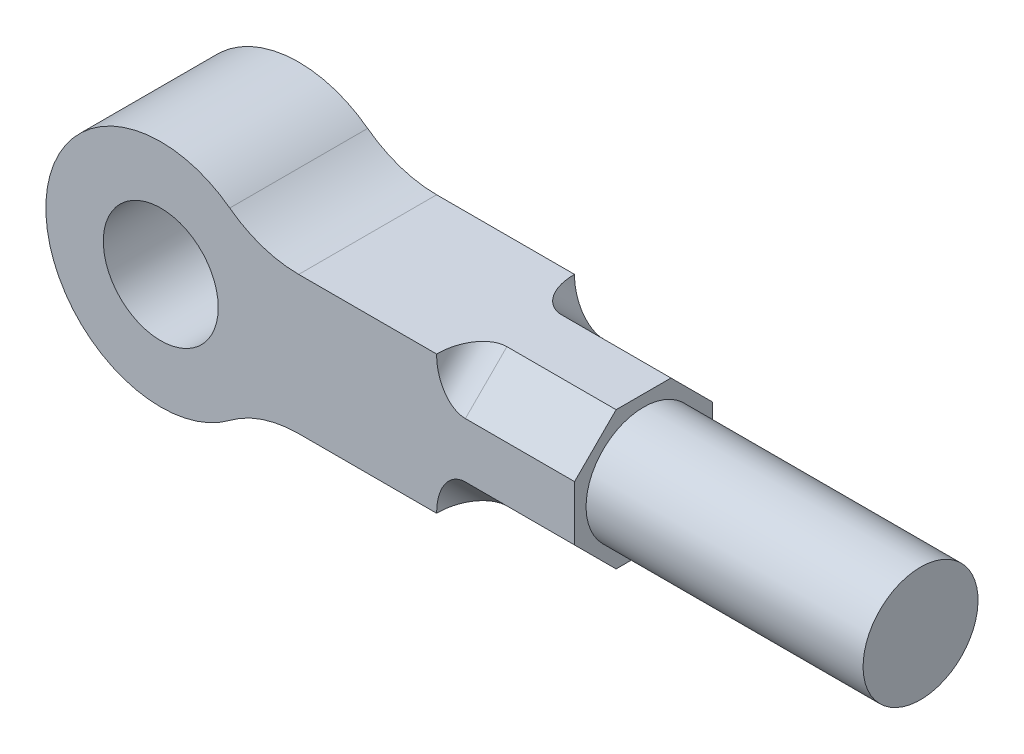
ISO-10303-21;
HEADER;
FILE_DESCRIPTION(('STEP AP214'),'2;1');
FILE_NAME('part.step','',(''),(''),'','','');
FILE_SCHEMA(('AUTOMOTIVE_DESIGN { 1 0 10303 214 1 1 1 1 }'));
ENDSEC;
DATA;
#1=APPLICATION_CONTEXT('core data for automotive mechanical design processes');
#2=APPLICATION_PROTOCOL_DEFINITION('international standard','automotive_design',2000,#1);
#3=PRODUCT_CONTEXT('',#1,'mechanical');
#4=PRODUCT('Part','Part','',(#3));
#5=PRODUCT_RELATED_PRODUCT_CATEGORY('part','',(#4));
#6=PRODUCT_DEFINITION_FORMATION('','',#4);
#7=PRODUCT_DEFINITION_CONTEXT('part definition',#1,'design');
#8=PRODUCT_DEFINITION('design','',#6,#7);
#9=PRODUCT_DEFINITION_SHAPE('','',#8);
#10=(LENGTH_UNIT() NAMED_UNIT(*) SI_UNIT(.MILLI.,.METRE.));
#11=(NAMED_UNIT(*) PLANE_ANGLE_UNIT() SI_UNIT($,.RADIAN.));
#12=(NAMED_UNIT(*) SI_UNIT($,.STERADIAN.) SOLID_ANGLE_UNIT());
#13=UNCERTAINTY_MEASURE_WITH_UNIT(LENGTH_MEASURE(1.E-05),#10,'distance_accuracy_value','');
#14=(GEOMETRIC_REPRESENTATION_CONTEXT(3) GLOBAL_UNCERTAINTY_ASSIGNED_CONTEXT((#13)) GLOBAL_UNIT_ASSIGNED_CONTEXT((#10,
#11,#12)) REPRESENTATION_CONTEXT('',''));
#15=CARTESIAN_POINT('',(0.,0.,0.));
#16=DIRECTION('',(0.,0.,1.));
#17=DIRECTION('',(1.,0.,0.));
#18=AXIS2_PLACEMENT_3D('',#15,#16,#17);
#19=CARTESIAN_POINT('',(60.,-80.,30.));
#20=DIRECTION('',(0.,0.,-1.));
#21=DIRECTION('',(-1.,0.,0.));
#22=AXIS2_PLACEMENT_3D('',#19,#20,#21);
#23=PLANE('',#22);
#24=DIRECTION('',(0.,-1.,0.));
#25=VECTOR('',#24,1.);
#26=CARTESIAN_POINT('',(120.,0.,30.));
#27=LINE('',#26,#25);
#28=CARTESIAN_POINT('',(120.,-29.617669529667,30.));
#29=VERTEX_POINT('',#28);
#30=CARTESIAN_POINT('',(120.,-29.9999999999999,30.));
#31=VERTEX_POINT('',#30);
#32=EDGE_CURVE('E354',#29,#31,#27,.T.);
#33=ORIENTED_EDGE('',*,*,#32,.F.);
#34=CARTESIAN_POINT('',(132.5,-29.6176695296671,30.));
#35=DIRECTION('',(0.,0.,-1.));
#36=DIRECTION('',(0.,1.,0.));
#37=AXIS2_PLACEMENT_3D('',#34,#35,#36);
#38=ELLIPSE('',#37,17.6776695296637,12.5);
#39=CARTESIAN_POINT('',(132.5,-11.9400000000054,30.));
#40=VERTEX_POINT('',#39);
#41=EDGE_CURVE('E277',#29,#40,#38,.T.);
#42=ORIENTED_EDGE('',*,*,#41,.T.);
#43=DIRECTION('',(1.,0.,0.));
#44=VECTOR('',#43,1.);
#45=CARTESIAN_POINT('',(120.,-11.9400000000053,30.));
#46=LINE('',#45,#44);
#47=CARTESIAN_POINT('',(180.,-11.9400000000054,30.));
#48=VERTEX_POINT('',#47);
#49=EDGE_CURVE('E326',#40,#48,#46,.T.);
#50=ORIENTED_EDGE('',*,*,#49,.T.);
#51=DIRECTION('',(0.,1.,0.));
#52=VECTOR('',#51,1.);
#53=CARTESIAN_POINT('',(180.,30.,30.));
#54=LINE('',#53,#52);
#55=CARTESIAN_POINT('',(180.,11.9399999999981,30.));
#56=VERTEX_POINT('',#55);
#57=EDGE_CURVE('E293',#48,#56,#54,.T.);
#58=ORIENTED_EDGE('',*,*,#57,.T.);
#59=DIRECTION('',(1.,0.,0.));
#60=VECTOR('',#59,1.);
#61=CARTESIAN_POINT('',(120.,11.9399999999981,30.));
#62=LINE('',#61,#60);
#63=CARTESIAN_POINT('',(132.5,11.9399999999981,30.));
#64=VERTEX_POINT('',#63);
#65=EDGE_CURVE('E315',#64,#56,#62,.T.);
#66=ORIENTED_EDGE('',*,*,#65,.F.);
#67=CARTESIAN_POINT('',(132.5,29.6176695296618,30.));
#68=DIRECTION('',(0.,0.,-1.));
#69=DIRECTION('',(0.,1.,0.));
#70=AXIS2_PLACEMENT_3D('',#67,#68,#69);
#71=ELLIPSE('',#70,17.6776695296637,12.5);
#72=CARTESIAN_POINT('',(120.,29.6176695296618,30.));
#73=VERTEX_POINT('',#72);
#74=EDGE_CURVE('E11',#64,#73,#71,.T.);
#75=ORIENTED_EDGE('',*,*,#74,.T.);
#76=DIRECTION('',(0.,-1.,0.));
#77=VECTOR('',#76,1.);
#78=CARTESIAN_POINT('',(120.,0.,30.));
#79=LINE('',#78,#77);
#80=CARTESIAN_POINT('',(120.,30.0000000000001,30.));
#81=VERTEX_POINT('',#80);
#82=EDGE_CURVE('E325',#81,#73,#79,.T.);
#83=ORIENTED_EDGE('',*,*,#82,.F.);
#84=DIRECTION('',(-1.,0.,0.));
#85=VECTOR('',#84,1.);
#86=CARTESIAN_POINT('',(60.,30.,30.));
#87=LINE('',#86,#85);
#88=CARTESIAN_POINT('',(60.,30.,30.));
#89=VERTEX_POINT('',#88);
#90=EDGE_CURVE('E290',#81,#89,#87,.T.);
#91=ORIENTED_EDGE('',*,*,#90,.T.);
#92=CARTESIAN_POINT('',(60.,80.,30.));
#93=DIRECTION('',(0.,0.,-1.));
#94=DIRECTION('',(-1.,0.,0.));
#95=AXIS2_PLACEMENT_3D('',#92,#93,#94);
#96=CIRCLE('',#95,50.);
#97=CARTESIAN_POINT('',(30.,40.,30.));
#98=VERTEX_POINT('',#97);
#99=EDGE_CURVE('E288',#89,#98,#96,.T.);
#100=ORIENTED_EDGE('',*,*,#99,.T.);
#101=CARTESIAN_POINT('',(0.,0.,30.));
#102=DIRECTION('',(0.,0.,1.));
#103=DIRECTION('',(1.,0.,0.));
#104=AXIS2_PLACEMENT_3D('',#101,#102,#103);
#105=CIRCLE('',#104,50.);
#106=CARTESIAN_POINT('',(30.,-40.,30.));
#107=VERTEX_POINT('',#106);
#108=EDGE_CURVE('E222',#98,#107,#105,.T.);
#109=ORIENTED_EDGE('',*,*,#108,.T.);
#110=CARTESIAN_POINT('',(60.,-80.,30.));
#111=DIRECTION('',(0.,0.,-1.));
#112=DIRECTION('',(-1.,0.,0.));
#113=AXIS2_PLACEMENT_3D('',#110,#111,#112);
#114=CIRCLE('',#113,50.);
#115=CARTESIAN_POINT('',(60.,-30.,30.));
#116=VERTEX_POINT('',#115);
#117=EDGE_CURVE('E216',#107,#116,#114,.T.);
#118=ORIENTED_EDGE('',*,*,#117,.T.);
#119=DIRECTION('',(1.,0.,0.));
#120=VECTOR('',#119,1.);
#121=CARTESIAN_POINT('',(60.,-30.,30.));
#122=LINE('',#121,#120);
#123=EDGE_CURVE('E297',#116,#31,#122,.T.);
#124=ORIENTED_EDGE('',*,*,#123,.T.);
#125=EDGE_LOOP('',(#33,#42,#50,#58,#66,#75,#83,#91,#100,#109,#118,#124));
#126=FACE_BOUND('',#125,.T.);
#127=CARTESIAN_POINT('',(0.,0.,30.));
#128=DIRECTION('',(0.,0.,1.));
#129=DIRECTION('',(1.,0.,0.));
#130=AXIS2_PLACEMENT_3D('',#127,#128,#129);
#131=CIRCLE('',#130,25.);
#132=CARTESIAN_POINT('',(25.,0.,30.));
#133=VERTEX_POINT('',#132);
#134=EDGE_CURVE('E204',#133,#133,#131,.T.);
#135=ORIENTED_EDGE('',*,*,#134,.F.);
#136=EDGE_LOOP('',(#135));
#137=FACE_BOUND('',#136,.T.);
#138=ADVANCED_FACE('F41',(#126,#137),#23,.F.);
#139=CARTESIAN_POINT('',(60.,-80.,-30.));
#140=DIRECTION('',(0.,0.,-1.));
#141=DIRECTION('',(-1.,0.,0.));
#142=AXIS2_PLACEMENT_3D('',#139,#140,#141);
#143=PLANE('',#142);
#144=DIRECTION('',(0.,1.,0.));
#145=VECTOR('',#144,1.);
#146=CARTESIAN_POINT('',(120.,0.,-30.));
#147=LINE('',#146,#145);
#148=CARTESIAN_POINT('',(120.,29.6176695296638,-30.));
#149=VERTEX_POINT('',#148);
#150=CARTESIAN_POINT('',(120.,30.,-30.));
#151=VERTEX_POINT('',#150);
#152=EDGE_CURVE('E336',#149,#151,#147,.T.);
#153=ORIENTED_EDGE('',*,*,#152,.F.);
#154=CARTESIAN_POINT('',(132.5,29.6176695296638,-30.));
#155=DIRECTION('',(0.,0.,-1.));
#156=DIRECTION('',(0.,-1.,0.));
#157=AXIS2_PLACEMENT_3D('',#154,#155,#156);
#158=ELLIPSE('',#157,17.6776695296637,12.5);
#159=CARTESIAN_POINT('',(132.5,11.9400000000001,-30.));
#160=VERTEX_POINT('',#159);
#161=EDGE_CURVE('E271',#149,#160,#158,.F.);
#162=ORIENTED_EDGE('',*,*,#161,.T.);
#163=DIRECTION('',(1.,0.,0.));
#164=VECTOR('',#163,1.);
#165=CARTESIAN_POINT('',(120.,11.9400000000001,-30.));
#166=LINE('',#165,#164);
#167=CARTESIAN_POINT('',(180.,11.94,-30.));
#168=VERTEX_POINT('',#167);
#169=EDGE_CURVE('E335',#160,#168,#166,.T.);
#170=ORIENTED_EDGE('',*,*,#169,.T.);
#171=DIRECTION('',(0.,1.,0.));
#172=VECTOR('',#171,1.);
#173=CARTESIAN_POINT('',(180.,30.,-30.));
#174=LINE('',#173,#172);
#175=CARTESIAN_POINT('',(180.,-11.9400000000054,-30.));
#176=VERTEX_POINT('',#175);
#177=EDGE_CURVE('E196',#176,#168,#174,.T.);
#178=ORIENTED_EDGE('',*,*,#177,.F.);
#179=DIRECTION('',(1.,0.,0.));
#180=VECTOR('',#179,1.);
#181=CARTESIAN_POINT('',(120.,-11.9400000000053,-30.));
#182=LINE('',#181,#180);
#183=CARTESIAN_POINT('',(132.5,-11.9400000000054,-30.));
#184=VERTEX_POINT('',#183);
#185=EDGE_CURVE('E175',#184,#176,#182,.T.);
#186=ORIENTED_EDGE('',*,*,#185,.F.);
#187=CARTESIAN_POINT('',(132.5,-29.617669529669,-30.));
#188=DIRECTION('',(0.,0.,-1.));
#189=DIRECTION('',(0.,-1.,0.));
#190=AXIS2_PLACEMENT_3D('',#187,#188,#189);
#191=ELLIPSE('',#190,17.6776695296637,12.5);
#192=CARTESIAN_POINT('',(120.,-29.617669529669,-30.));
#193=VERTEX_POINT('',#192);
#194=EDGE_CURVE('E186',#184,#193,#191,.F.);
#195=ORIENTED_EDGE('',*,*,#194,.T.);
#196=DIRECTION('',(0.,1.,0.));
#197=VECTOR('',#196,1.);
#198=CARTESIAN_POINT('',(120.,0.,-30.));
#199=LINE('',#198,#197);
#200=CARTESIAN_POINT('',(120.,-29.9999999999999,-30.));
#201=VERTEX_POINT('',#200);
#202=EDGE_CURVE('E169',#201,#193,#199,.T.);
#203=ORIENTED_EDGE('',*,*,#202,.F.);
#204=DIRECTION('',(1.,0.,0.));
#205=VECTOR('',#204,1.);
#206=CARTESIAN_POINT('',(60.,-30.,-30.));
#207=LINE('',#206,#205);
#208=CARTESIAN_POINT('',(60.,-30.,-30.));
#209=VERTEX_POINT('',#208);
#210=EDGE_CURVE('E182',#209,#201,#207,.T.);
#211=ORIENTED_EDGE('',*,*,#210,.F.);
#212=CARTESIAN_POINT('',(60.,-80.,-30.));
#213=DIRECTION('',(0.,0.,-1.));
#214=DIRECTION('',(-1.,0.,0.));
#215=AXIS2_PLACEMENT_3D('',#212,#213,#214);
#216=CIRCLE('',#215,50.);
#217=CARTESIAN_POINT('',(30.,-40.,-30.));
#218=VERTEX_POINT('',#217);
#219=EDGE_CURVE('E197',#218,#209,#216,.T.);
#220=ORIENTED_EDGE('',*,*,#219,.F.);
#221=CARTESIAN_POINT('',(0.,0.,-30.));
#222=DIRECTION('',(0.,0.,1.));
#223=DIRECTION('',(1.,0.,0.));
#224=AXIS2_PLACEMENT_3D('',#221,#222,#223);
#225=CIRCLE('',#224,50.);
#226=CARTESIAN_POINT('',(30.,40.,-30.));
#227=VERTEX_POINT('',#226);
#228=EDGE_CURVE('E213',#227,#218,#225,.T.);
#229=ORIENTED_EDGE('',*,*,#228,.F.);
#230=CARTESIAN_POINT('',(60.,80.,-30.));
#231=DIRECTION('',(0.,0.,-1.));
#232=DIRECTION('',(-1.,0.,0.));
#233=AXIS2_PLACEMENT_3D('',#230,#231,#232);
#234=CIRCLE('',#233,50.);
#235=CARTESIAN_POINT('',(60.,30.,-30.));
#236=VERTEX_POINT('',#235);
#237=EDGE_CURVE('E210',#236,#227,#234,.T.);
#238=ORIENTED_EDGE('',*,*,#237,.F.);
#239=DIRECTION('',(-1.,0.,0.));
#240=VECTOR('',#239,1.);
#241=CARTESIAN_POINT('',(60.,30.,-30.));
#242=LINE('',#241,#240);
#243=EDGE_CURVE('E202',#151,#236,#242,.T.);
#244=ORIENTED_EDGE('',*,*,#243,.F.);
#245=EDGE_LOOP('',(#153,#162,#170,#178,#186,#195,#203,#211,#220,#229,#238,#244));
#246=FACE_BOUND('',#245,.T.);
#247=CARTESIAN_POINT('',(0.,0.,-30.));
#248=DIRECTION('',(0.,0.,1.));
#249=DIRECTION('',(1.,0.,0.));
#250=AXIS2_PLACEMENT_3D('',#247,#248,#249);
#251=CIRCLE('',#250,25.);
#252=CARTESIAN_POINT('',(25.,0.,-30.));
#253=VERTEX_POINT('',#252);
#254=EDGE_CURVE('E307',#253,#253,#251,.T.);
#255=ORIENTED_EDGE('',*,*,#254,.T.);
#256=EDGE_LOOP('',(#255));
#257=FACE_BOUND('',#256,.T.);
#258=ADVANCED_FACE('F179',(#246,#257),#143,.T.);
#259=CARTESIAN_POINT('',(60.,-80.,30.));
#260=DIRECTION('',(0.,0.,-1.));
#261=DIRECTION('',(-1.,0.,0.));
#262=AXIS2_PLACEMENT_3D('',#259,#260,#261);
#263=CYLINDRICAL_SURFACE('',#262,50.);
#264=ORIENTED_EDGE('',*,*,#219,.T.);
#265=DIRECTION('',(0.,0.,-1.));
#266=VECTOR('',#265,1.);
#267=CARTESIAN_POINT('',(60.,-30.,30.));
#268=LINE('',#267,#266);
#269=EDGE_CURVE('E193',#116,#209,#268,.T.);
#270=ORIENTED_EDGE('',*,*,#269,.F.);
#271=ORIENTED_EDGE('',*,*,#117,.F.);
#272=DIRECTION('',(0.,0.,-1.));
#273=VECTOR('',#272,1.);
#274=CARTESIAN_POINT('',(30.,-40.,30.));
#275=LINE('',#274,#273);
#276=EDGE_CURVE('E217',#107,#218,#275,.T.);
#277=ORIENTED_EDGE('',*,*,#276,.T.);
#278=EDGE_LOOP('',(#264,#270,#271,#277));
#279=FACE_BOUND('',#278,.T.);
#280=ADVANCED_FACE('F422',(#279),#263,.F.);
#281=CARTESIAN_POINT('',(60.,-30.,30.));
#282=DIRECTION('',(0.,1.,0.));
#283=DIRECTION('',(-1.,0.,0.));
#284=AXIS2_PLACEMENT_3D('',#281,#282,#283);
#285=PLANE('',#284);
#286=DIRECTION('',(0.,0.,-1.));
#287=VECTOR('',#286,1.);
#288=CARTESIAN_POINT('',(180.,-30.,30.));
#289=LINE('',#288,#287);
#290=CARTESIAN_POINT('',(180.,-30.,11.9400000000035));
#291=VERTEX_POINT('',#290);
#292=CARTESIAN_POINT('',(180.,-30.,-11.9400000000037));
#293=VERTEX_POINT('',#292);
#294=EDGE_CURVE('E234',#291,#293,#289,.T.);
#295=ORIENTED_EDGE('',*,*,#294,.F.);
#296=DIRECTION('',(1.,0.,0.));
#297=VECTOR('',#296,1.);
#298=CARTESIAN_POINT('',(120.,-29.9999999999999,11.9400000000034));
#299=LINE('',#298,#297);
#300=CARTESIAN_POINT('',(132.5,-29.9999999999999,11.9400000000034));
#301=VERTEX_POINT('',#300);
#302=EDGE_CURVE('E351',#301,#291,#299,.T.);
#303=ORIENTED_EDGE('',*,*,#302,.F.);
#304=CARTESIAN_POINT('',(132.5,-30.,29.6176695296671));
#305=DIRECTION('',(0.,1.,0.));
#306=DIRECTION('',(0.,0.,1.));
#307=AXIS2_PLACEMENT_3D('',#304,#305,#306);
#308=ELLIPSE('',#307,17.6776695296637,12.5);
#309=CARTESIAN_POINT('',(120.,-29.9999999999999,29.6176695296671));
#310=VERTEX_POINT('',#309);
#311=EDGE_CURVE('E280',#301,#310,#308,.T.);
#312=ORIENTED_EDGE('',*,*,#311,.T.);
#313=DIRECTION('',(0.,0.,-1.));
#314=VECTOR('',#313,1.);
#315=CARTESIAN_POINT('',(120.,-29.9999999999999,0.));
#316=LINE('',#315,#314);
#317=EDGE_CURVE('E360',#31,#310,#316,.T.);
#318=ORIENTED_EDGE('',*,*,#317,.F.);
#319=ORIENTED_EDGE('',*,*,#123,.F.);
#320=ORIENTED_EDGE('',*,*,#269,.T.);
#321=ORIENTED_EDGE('',*,*,#210,.T.);
#322=DIRECTION('',(0.,0.,-1.));
#323=VECTOR('',#322,1.);
#324=CARTESIAN_POINT('',(120.,-29.9999999999999,0.));
#325=LINE('',#324,#323);
#326=CARTESIAN_POINT('',(120.,-29.9999999999999,-29.6176695296691));
#327=VERTEX_POINT('',#326);
#328=EDGE_CURVE('E166',#327,#201,#325,.T.);
#329=ORIENTED_EDGE('',*,*,#328,.F.);
#330=CARTESIAN_POINT('',(132.5,-30.,-29.6176695296691));
#331=DIRECTION('',(0.,1.,0.));
#332=DIRECTION('',(0.,0.,1.));
#333=AXIS2_PLACEMENT_3D('',#330,#331,#332);
#334=ELLIPSE('',#333,17.6776695296637,12.5);
#335=CARTESIAN_POINT('',(132.5,-29.9999999999999,-11.9400000000037));
#336=VERTEX_POINT('',#335);
#337=EDGE_CURVE('E266',#327,#336,#334,.T.);
#338=ORIENTED_EDGE('',*,*,#337,.T.);
#339=DIRECTION('',(1.,0.,0.));
#340=VECTOR('',#339,1.);
#341=CARTESIAN_POINT('',(120.,-29.9999999999999,-11.9400000000037));
#342=LINE('',#341,#340);
#343=EDGE_CURVE('E345',#336,#293,#342,.T.);
#344=ORIENTED_EDGE('',*,*,#343,.T.);
#345=EDGE_LOOP('',(#295,#303,#312,#318,#319,#320,#321,#329,#338,#344));
#346=FACE_BOUND('',#345,.T.);
#347=ADVANCED_FACE('F191',(#346),#285,.F.);
#348=CARTESIAN_POINT('',(180.,30.,30.));
#349=DIRECTION('',(-1.,0.,0.));
#350=DIRECTION('',(0.,-1.,0.));
#351=AXIS2_PLACEMENT_3D('',#348,#349,#350);
#352=PLANE('',#351);
#353=CARTESIAN_POINT('',(180.,-1.66533453693774E-13,0.));
#354=DIRECTION('',(1.,0.,0.));
#355=DIRECTION('',(0.,1.,0.));
#356=AXIS2_PLACEMENT_3D('',#353,#354,#355);
#357=CIRCLE('',#356,25.);
#358=CARTESIAN_POINT('',(180.,24.9999999999998,0.));
#359=VERTEX_POINT('',#358);
#360=EDGE_CURVE('E240',#359,#359,#357,.T.);
#361=ORIENTED_EDGE('',*,*,#360,.F.);
#362=EDGE_LOOP('',(#361));
#363=FACE_BOUND('',#362,.T.);
#364=ORIENTED_EDGE('',*,*,#57,.F.);
#365=DIRECTION('',(0.,0.707106781186547,0.707106781186548));
#366=VECTOR('',#365,1.);
#367=CARTESIAN_POINT('',(180.,-20.9700000000018,20.9700000000016));
#368=LINE('',#367,#366);
#369=EDGE_CURVE('E339',#291,#48,#368,.T.);
#370=ORIENTED_EDGE('',*,*,#369,.F.);
#371=ORIENTED_EDGE('',*,*,#294,.T.);
#372=DIRECTION('',(0.,-0.707106781186548,0.707106781186547));
#373=VECTOR('',#372,1.);
#374=CARTESIAN_POINT('',(180.,-20.9700000000028,-20.9700000000026));
#375=LINE('',#374,#373);
#376=EDGE_CURVE('E188',#176,#293,#375,.T.);
#377=ORIENTED_EDGE('',*,*,#376,.F.);
#378=ORIENTED_EDGE('',*,*,#177,.T.);
#379=DIRECTION('',(0.,-0.707106781186548,-0.707106781186548));
#380=VECTOR('',#379,1.);
#381=CARTESIAN_POINT('',(180.,20.9699999999999,-20.9700000000001));
#382=LINE('',#381,#380);
#383=CARTESIAN_POINT('',(180.,30.,-11.94));
#384=VERTEX_POINT('',#383);
#385=EDGE_CURVE('E340',#384,#168,#382,.T.);
#386=ORIENTED_EDGE('',*,*,#385,.F.);
#387=DIRECTION('',(0.,0.,-1.));
#388=VECTOR('',#387,1.);
#389=CARTESIAN_POINT('',(180.,30.,30.));
#390=LINE('',#389,#388);
#391=CARTESIAN_POINT('',(180.,30.,11.9400000000017));
#392=VERTEX_POINT('',#391);
#393=EDGE_CURVE('E230',#392,#384,#390,.T.);
#394=ORIENTED_EDGE('',*,*,#393,.F.);
#395=DIRECTION('',(0.,0.707106781186548,-0.707106781186547));
#396=VECTOR('',#395,1.);
#397=CARTESIAN_POINT('',(180.,20.9699999999989,20.9699999999991));
#398=LINE('',#397,#396);
#399=EDGE_CURVE('E321',#56,#392,#398,.T.);
#400=ORIENTED_EDGE('',*,*,#399,.F.);
#401=EDGE_LOOP('',(#364,#370,#371,#377,#378,#386,#394,#400));
#402=FACE_BOUND('',#401,.T.);
#403=ADVANCED_FACE('F387',(#363,#402),#352,.F.);
#404=CARTESIAN_POINT('',(60.,30.,30.));
#405=DIRECTION('',(0.,-1.,0.));
#406=DIRECTION('',(1.,0.,0.));
#407=AXIS2_PLACEMENT_3D('',#404,#405,#406);
#408=PLANE('',#407);
#409=ORIENTED_EDGE('',*,*,#393,.T.);
#410=DIRECTION('',(1.,0.,0.));
#411=VECTOR('',#410,1.);
#412=CARTESIAN_POINT('',(120.,30.0000000000001,-11.94));
#413=LINE('',#412,#411);
#414=CARTESIAN_POINT('',(132.5,30.0000000000001,-11.94));
#415=VERTEX_POINT('',#414);
#416=EDGE_CURVE('E332',#415,#384,#413,.T.);
#417=ORIENTED_EDGE('',*,*,#416,.F.);
#418=CARTESIAN_POINT('',(132.5,30.,-29.6176695296637));
#419=DIRECTION('',(0.,-1.,0.));
#420=DIRECTION('',(0.,0.,-1.));
#421=AXIS2_PLACEMENT_3D('',#418,#419,#420);
#422=ELLIPSE('',#421,17.6776695296637,12.5);
#423=CARTESIAN_POINT('',(120.,30.0000000000001,-29.6176695296637));
#424=VERTEX_POINT('',#423);
#425=EDGE_CURVE('E274',#415,#424,#422,.T.);
#426=ORIENTED_EDGE('',*,*,#425,.T.);
#427=DIRECTION('',(0.,0.,1.));
#428=VECTOR('',#427,1.);
#429=CARTESIAN_POINT('',(120.,30.0000000000001,0.));
#430=LINE('',#429,#428);
#431=EDGE_CURVE('E344',#151,#424,#430,.T.);
#432=ORIENTED_EDGE('',*,*,#431,.F.);
#433=ORIENTED_EDGE('',*,*,#243,.T.);
#434=DIRECTION('',(0.,0.,-1.));
#435=VECTOR('',#434,1.);
#436=CARTESIAN_POINT('',(60.,30.,30.));
#437=LINE('',#436,#435);
#438=EDGE_CURVE('E226',#89,#236,#437,.T.);
#439=ORIENTED_EDGE('',*,*,#438,.F.);
#440=ORIENTED_EDGE('',*,*,#90,.F.);
#441=DIRECTION('',(0.,0.,1.));
#442=VECTOR('',#441,1.);
#443=CARTESIAN_POINT('',(120.,30.0000000000001,0.));
#444=LINE('',#443,#442);
#445=CARTESIAN_POINT('',(120.,30.0000000000001,29.6176695296617));
#446=VERTEX_POINT('',#445);
#447=EDGE_CURVE('E318',#446,#81,#444,.T.);
#448=ORIENTED_EDGE('',*,*,#447,.F.);
#449=CARTESIAN_POINT('',(132.5,30.,29.6176695296618));
#450=DIRECTION('',(0.,-1.,0.));
#451=DIRECTION('',(0.,0.,-1.));
#452=AXIS2_PLACEMENT_3D('',#449,#450,#451);
#453=ELLIPSE('',#452,17.6776695296637,12.5);
#454=CARTESIAN_POINT('',(132.5,30.0000000000001,11.9400000000017));
#455=VERTEX_POINT('',#454);
#456=EDGE_CURVE('E50',#446,#455,#453,.T.);
#457=ORIENTED_EDGE('',*,*,#456,.T.);
#458=DIRECTION('',(1.,0.,0.));
#459=VECTOR('',#458,1.);
#460=CARTESIAN_POINT('',(120.,30.0000000000001,11.9400000000017));
#461=LINE('',#460,#459);
#462=EDGE_CURVE('E311',#455,#392,#461,.T.);
#463=ORIENTED_EDGE('',*,*,#462,.T.);
#464=EDGE_LOOP('',(#409,#417,#426,#432,#433,#439,#440,#448,#457,#463));
#465=FACE_BOUND('',#464,.T.);
#466=ADVANCED_FACE('F390',(#465),#408,.F.);
#467=CARTESIAN_POINT('',(60.,80.,30.));
#468=DIRECTION('',(0.,0.,-1.));
#469=DIRECTION('',(-1.,0.,0.));
#470=AXIS2_PLACEMENT_3D('',#467,#468,#469);
#471=CYLINDRICAL_SURFACE('',#470,50.);
#472=ORIENTED_EDGE('',*,*,#237,.T.);
#473=DIRECTION('',(0.,0.,-1.));
#474=VECTOR('',#473,1.);
#475=CARTESIAN_POINT('',(30.,40.,30.));
#476=LINE('',#475,#474);
#477=EDGE_CURVE('E221',#98,#227,#476,.T.);
#478=ORIENTED_EDGE('',*,*,#477,.F.);
#479=ORIENTED_EDGE('',*,*,#99,.F.);
#480=ORIENTED_EDGE('',*,*,#438,.T.);
#481=EDGE_LOOP('',(#472,#478,#479,#480));
#482=FACE_BOUND('',#481,.T.);
#483=ADVANCED_FACE('F431',(#482),#471,.F.);
#484=CARTESIAN_POINT('',(0.,0.,30.));
#485=DIRECTION('',(0.,0.,-1.));
#486=DIRECTION('',(-1.,0.,0.));
#487=AXIS2_PLACEMENT_3D('',#484,#485,#486);
#488=CYLINDRICAL_SURFACE('',#487,50.);
#489=ORIENTED_EDGE('',*,*,#228,.T.);
#490=ORIENTED_EDGE('',*,*,#276,.F.);
#491=ORIENTED_EDGE('',*,*,#108,.F.);
#492=ORIENTED_EDGE('',*,*,#477,.T.);
#493=EDGE_LOOP('',(#489,#490,#491,#492));
#494=FACE_BOUND('',#493,.T.);
#495=ADVANCED_FACE('F428',(#494),#488,.T.);
#496=CARTESIAN_POINT('',(0.,0.,30.));
#497=DIRECTION('',(0.,0.,-1.));
#498=DIRECTION('',(-1.,0.,0.));
#499=AXIS2_PLACEMENT_3D('',#496,#497,#498);
#500=CYLINDRICAL_SURFACE('',#499,25.);
#501=ORIENTED_EDGE('',*,*,#134,.T.);
#502=EDGE_LOOP('',(#501));
#503=FACE_BOUND('',#502,.T.);
#504=ORIENTED_EDGE('',*,*,#254,.F.);
#505=EDGE_LOOP('',(#504));
#506=FACE_BOUND('',#505,.T.);
#507=ADVANCED_FACE('F425',(#503,#506),#500,.F.);
#508=CARTESIAN_POINT('',(120.,20.969999999999,20.9699999999991));
#509=DIRECTION('',(0.,-0.707106781186547,-0.707106781186548));
#510=DIRECTION('',(0.,0.707106781186548,-0.707106781186547));
#511=AXIS2_PLACEMENT_3D('',#508,#509,#510);
#512=PLANE('',#511);
#513=ORIENTED_EDGE('',*,*,#462,.F.);
#514=DIRECTION('',(0.,0.707106781186548,-0.707106781186547));
#515=VECTOR('',#514,1.);
#516=CARTESIAN_POINT('',(132.5,20.969999999999,20.9699999999991));
#517=LINE('',#516,#515);
#518=EDGE_CURVE('E57',#455,#64,#517,.F.);
#519=ORIENTED_EDGE('',*,*,#518,.T.);
#520=ORIENTED_EDGE('',*,*,#65,.T.);
#521=ORIENTED_EDGE('',*,*,#399,.T.);
#522=EDGE_LOOP('',(#513,#519,#520,#521));
#523=FACE_BOUND('',#522,.T.);
#524=ADVANCED_FACE('F565',(#523),#512,.F.);
#525=CARTESIAN_POINT('',(120.,0.,0.));
#526=DIRECTION('',(1.,0.,0.));
#527=DIRECTION('',(0.,1.,0.));
#528=AXIS2_PLACEMENT_3D('',#525,#526,#527);
#529=PLANE('',#528);
#530=ORIENTED_EDGE('',*,*,#82,.T.);
#531=DIRECTION('',(0.,0.707106781186548,-0.707106781186547));
#532=VECTOR('',#531,1.);
#533=CARTESIAN_POINT('',(120.,29.8088347648308,29.808834764831));
#534=LINE('',#533,#532);
#535=EDGE_CURVE('E260',#73,#446,#534,.T.);
#536=ORIENTED_EDGE('',*,*,#535,.T.);
#537=ORIENTED_EDGE('',*,*,#447,.T.);
#538=EDGE_LOOP('',(#530,#536,#537));
#539=FACE_BOUND('',#538,.T.);
#540=ADVANCED_FACE('F461',(#539),#529,.T.);
#541=CARTESIAN_POINT('',(120.,20.97,-20.9700000000001));
#542=DIRECTION('',(0.,-0.707106781186547,0.707106781186547));
#543=DIRECTION('',(0.,-0.707106781186548,-0.707106781186548));
#544=AXIS2_PLACEMENT_3D('',#541,#542,#543);
#545=PLANE('',#544);
#546=ORIENTED_EDGE('',*,*,#169,.F.);
#547=DIRECTION('',(0.,-0.707106781186548,-0.707106781186548));
#548=VECTOR('',#547,1.);
#549=CARTESIAN_POINT('',(132.5,20.97,-20.9700000000001));
#550=LINE('',#549,#548);
#551=EDGE_CURVE('E250',#160,#415,#550,.F.);
#552=ORIENTED_EDGE('',*,*,#551,.T.);
#553=ORIENTED_EDGE('',*,*,#416,.T.);
#554=ORIENTED_EDGE('',*,*,#385,.T.);
#555=EDGE_LOOP('',(#546,#552,#553,#554));
#556=FACE_BOUND('',#555,.T.);
#557=ADVANCED_FACE('F480',(#556),#545,.F.);
#558=CARTESIAN_POINT('',(120.,0.,0.));
#559=DIRECTION('',(1.,0.,0.));
#560=DIRECTION('',(0.,1.,0.));
#561=AXIS2_PLACEMENT_3D('',#558,#559,#560);
#562=PLANE('',#561);
#563=ORIENTED_EDGE('',*,*,#431,.T.);
#564=DIRECTION('',(0.,-0.707106781186548,-0.707106781186548));
#565=VECTOR('',#564,1.);
#566=CARTESIAN_POINT('',(120.,29.8088347648318,-29.8088347648319));
#567=LINE('',#566,#565);
#568=EDGE_CURVE('E246',#424,#149,#567,.T.);
#569=ORIENTED_EDGE('',*,*,#568,.T.);
#570=ORIENTED_EDGE('',*,*,#152,.T.);
#571=EDGE_LOOP('',(#563,#569,#570));
#572=FACE_BOUND('',#571,.T.);
#573=ADVANCED_FACE('F475',(#572),#562,.T.);
#574=CARTESIAN_POINT('',(120.,-20.9700000000027,-20.9700000000026));
#575=DIRECTION('',(0.,0.707106781186547,0.707106781186548));
#576=DIRECTION('',(0.,-0.707106781186548,0.707106781186547));
#577=AXIS2_PLACEMENT_3D('',#574,#575,#576);
#578=PLANE('',#577);
#579=ORIENTED_EDGE('',*,*,#343,.F.);
#580=DIRECTION('',(0.,-0.707106781186548,0.707106781186547));
#581=VECTOR('',#580,1.);
#582=CARTESIAN_POINT('',(132.5,-20.9700000000027,-20.9700000000026));
#583=LINE('',#582,#581);
#584=EDGE_CURVE('E243',#336,#184,#583,.F.);
#585=ORIENTED_EDGE('',*,*,#584,.T.);
#586=ORIENTED_EDGE('',*,*,#185,.T.);
#587=ORIENTED_EDGE('',*,*,#376,.T.);
#588=EDGE_LOOP('',(#579,#585,#586,#587));
#589=FACE_BOUND('',#588,.T.);
#590=ADVANCED_FACE('F486',(#589),#578,.F.);
#591=CARTESIAN_POINT('',(120.,0.,0.));
#592=DIRECTION('',(1.,0.,0.));
#593=DIRECTION('',(0.,1.,0.));
#594=AXIS2_PLACEMENT_3D('',#591,#592,#593);
#595=PLANE('',#594);
#596=ORIENTED_EDGE('',*,*,#202,.T.);
#597=DIRECTION('',(0.,-0.707106781186548,0.707106781186547));
#598=VECTOR('',#597,1.);
#599=CARTESIAN_POINT('',(120.,-29.8088347648346,-29.8088347648345));
#600=LINE('',#599,#598);
#601=EDGE_CURVE('E171',#193,#327,#600,.T.);
#602=ORIENTED_EDGE('',*,*,#601,.T.);
#603=ORIENTED_EDGE('',*,*,#328,.T.);
#604=EDGE_LOOP('',(#596,#602,#603));
#605=FACE_BOUND('',#604,.T.);
#606=ADVANCED_FACE('F168',(#605),#595,.T.);
#607=CARTESIAN_POINT('',(120.,-20.9700000000017,20.9700000000016));
#608=DIRECTION('',(0.,0.707106781186548,-0.707106781186547));
#609=DIRECTION('',(0.,0.707106781186547,0.707106781186548));
#610=AXIS2_PLACEMENT_3D('',#607,#608,#609);
#611=PLANE('',#610);
#612=ORIENTED_EDGE('',*,*,#49,.F.);
#613=DIRECTION('',(0.,0.707106781186547,0.707106781186548));
#614=VECTOR('',#613,1.);
#615=CARTESIAN_POINT('',(132.5,-20.9700000000017,20.9700000000016));
#616=LINE('',#615,#614);
#617=EDGE_CURVE('E257',#40,#301,#616,.F.);
#618=ORIENTED_EDGE('',*,*,#617,.T.);
#619=ORIENTED_EDGE('',*,*,#302,.T.);
#620=ORIENTED_EDGE('',*,*,#369,.T.);
#621=EDGE_LOOP('',(#612,#618,#619,#620));
#622=FACE_BOUND('',#621,.T.);
#623=ADVANCED_FACE('F402',(#622),#611,.F.);
#624=CARTESIAN_POINT('',(120.,0.,0.));
#625=DIRECTION('',(1.,0.,0.));
#626=DIRECTION('',(0.,1.,0.));
#627=AXIS2_PLACEMENT_3D('',#624,#625,#626);
#628=PLANE('',#627);
#629=ORIENTED_EDGE('',*,*,#317,.T.);
#630=DIRECTION('',(0.,0.707106781186547,0.707106781186548));
#631=VECTOR('',#630,1.);
#632=CARTESIAN_POINT('',(120.,-29.8088347648336,29.8088347648335));
#633=LINE('',#632,#631);
#634=EDGE_CURVE('E253',#310,#29,#633,.T.);
#635=ORIENTED_EDGE('',*,*,#634,.T.);
#636=ORIENTED_EDGE('',*,*,#32,.T.);
#637=EDGE_LOOP('',(#629,#635,#636));
#638=FACE_BOUND('',#637,.T.);
#639=ADVANCED_FACE('F383',(#638),#628,.T.);
#640=CARTESIAN_POINT('',(300.5,-2.78018349083216E-13,0.));
#641=DIRECTION('',(-1.,0.,0.));
#642=DIRECTION('',(0.,-1.,0.));
#643=AXIS2_PLACEMENT_3D('',#640,#641,#642);
#644=CYLINDRICAL_SURFACE('',#643,25.);
#645=CARTESIAN_POINT('',(300.5,-2.78018349083216E-13,0.));
#646=DIRECTION('',(1.,0.,0.));
#647=DIRECTION('',(0.,1.,0.));
#648=AXIS2_PLACEMENT_3D('',#645,#646,#647);
#649=CIRCLE('',#648,25.);
#650=CARTESIAN_POINT('',(300.5,24.9999999999997,0.));
#651=VERTEX_POINT('',#650);
#652=EDGE_CURVE('E372',#651,#651,#649,.T.);
#653=ORIENTED_EDGE('',*,*,#652,.F.);
#654=EDGE_LOOP('',(#653));
#655=FACE_BOUND('',#654,.T.);
#656=ORIENTED_EDGE('',*,*,#360,.T.);
#657=EDGE_LOOP('',(#656));
#658=FACE_BOUND('',#657,.T.);
#659=ADVANCED_FACE('F380',(#655,#658),#644,.T.);
#660=CARTESIAN_POINT('',(300.5,-2.62555238553201E-13,0.));
#661=DIRECTION('',(1.,0.,0.));
#662=DIRECTION('',(0.,1.,0.));
#663=AXIS2_PLACEMENT_3D('',#660,#661,#662);
#664=PLANE('',#663);
#665=ORIENTED_EDGE('',*,*,#652,.T.);
#666=EDGE_LOOP('',(#665));
#667=FACE_BOUND('',#666,.T.);
#668=ADVANCED_FACE('F378',(#667),#664,.T.);
#669=CARTESIAN_POINT('',(132.5,-29.8088347648346,-29.8088347648345));
#670=DIRECTION('',(0.,-0.707106781186548,0.707106781186547));
#671=DIRECTION('',(0.,-0.707106781186547,-0.707106781186548));
#672=AXIS2_PLACEMENT_3D('',#669,#670,#671);
#673=CYLINDRICAL_SURFACE('',#672,12.5);
#674=ORIENTED_EDGE('',*,*,#194,.F.);
#675=ORIENTED_EDGE('',*,*,#584,.F.);
#676=ORIENTED_EDGE('',*,*,#337,.F.);
#677=ORIENTED_EDGE('',*,*,#601,.F.);
#678=EDGE_LOOP('',(#674,#675,#676,#677));
#679=FACE_BOUND('',#678,.T.);
#680=ADVANCED_FACE('F443',(#679),#673,.F.);
#681=CARTESIAN_POINT('',(132.5,29.8088347648318,-29.8088347648319));
#682=DIRECTION('',(0.,-0.707106781186548,-0.707106781186548));
#683=DIRECTION('',(0.,0.707106781186548,-0.707106781186548));
#684=AXIS2_PLACEMENT_3D('',#681,#682,#683);
#685=CYLINDRICAL_SURFACE('',#684,12.5);
#686=ORIENTED_EDGE('',*,*,#425,.F.);
#687=ORIENTED_EDGE('',*,*,#551,.F.);
#688=ORIENTED_EDGE('',*,*,#161,.F.);
#689=ORIENTED_EDGE('',*,*,#568,.F.);
#690=EDGE_LOOP('',(#686,#687,#688,#689));
#691=FACE_BOUND('',#690,.T.);
#692=ADVANCED_FACE('F446',(#691),#685,.F.);
#693=CARTESIAN_POINT('',(132.5,-29.8088347648336,29.8088347648335));
#694=DIRECTION('',(0.,0.707106781186547,0.707106781186548));
#695=DIRECTION('',(0.,-0.707106781186548,0.707106781186547));
#696=AXIS2_PLACEMENT_3D('',#693,#694,#695);
#697=CYLINDRICAL_SURFACE('',#696,12.5);
#698=ORIENTED_EDGE('',*,*,#311,.F.);
#699=ORIENTED_EDGE('',*,*,#617,.F.);
#700=ORIENTED_EDGE('',*,*,#41,.F.);
#701=ORIENTED_EDGE('',*,*,#634,.F.);
#702=EDGE_LOOP('',(#698,#699,#700,#701));
#703=FACE_BOUND('',#702,.T.);
#704=ADVANCED_FACE('F408',(#703),#697,.F.);
#705=CARTESIAN_POINT('',(132.5,29.8088347648308,29.808834764831));
#706=DIRECTION('',(0.,0.707106781186548,-0.707106781186547));
#707=DIRECTION('',(0.,0.707106781186547,0.707106781186548));
#708=AXIS2_PLACEMENT_3D('',#705,#706,#707);
#709=CYLINDRICAL_SURFACE('',#708,12.5);
#710=ORIENTED_EDGE('',*,*,#74,.F.);
#711=ORIENTED_EDGE('',*,*,#518,.F.);
#712=ORIENTED_EDGE('',*,*,#456,.F.);
#713=ORIENTED_EDGE('',*,*,#535,.F.);
#714=EDGE_LOOP('',(#710,#711,#712,#713));
#715=FACE_BOUND('',#714,.T.);
#716=ADVANCED_FACE('F43',(#715),#709,.F.);
#717=CLOSED_SHELL('',(#138,#258,#280,#347,#403,#466,#483,#495,#507,#524,#540,#557,#573,#590,
#606,#623,#639,#659,#668,#680,#692,#704,#716));
#718=MANIFOLD_SOLID_BREP('B2',#717);
#719=ADVANCED_BREP_SHAPE_REPRESENTATION('',(#18,#718),#14);
#720=SHAPE_DEFINITION_REPRESENTATION(#9,#719);
ENDSEC;
END-ISO-10303-21;
